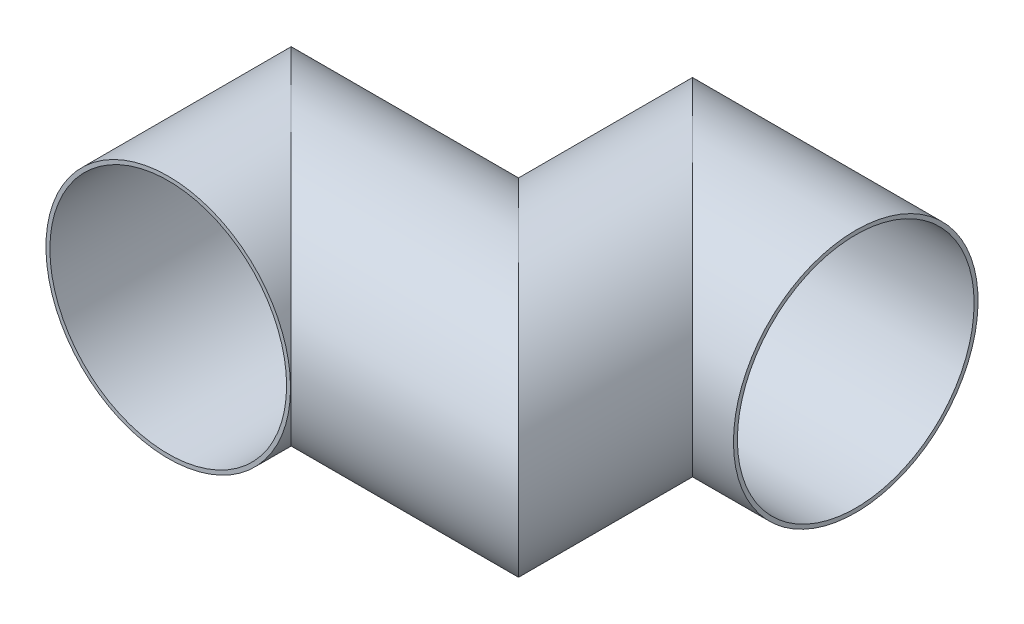
ISO-10303-21;
HEADER;
FILE_DESCRIPTION(('STEP AP214'),'2;1');
FILE_NAME('part.step','',(''),(''),'','','');
FILE_SCHEMA(('AUTOMOTIVE_DESIGN { 1 0 10303 214 1 1 1 1 }'));
ENDSEC;
DATA;
#1=APPLICATION_CONTEXT('core data for automotive mechanical design processes');
#2=APPLICATION_PROTOCOL_DEFINITION('international standard','automotive_design',2000,#1);
#3=PRODUCT_CONTEXT('',#1,'mechanical');
#4=PRODUCT('Part','Part','',(#3));
#5=PRODUCT_RELATED_PRODUCT_CATEGORY('part','',(#4));
#6=PRODUCT_DEFINITION_FORMATION('','',#4);
#7=PRODUCT_DEFINITION_CONTEXT('part definition',#1,'design');
#8=PRODUCT_DEFINITION('design','',#6,#7);
#9=PRODUCT_DEFINITION_SHAPE('','',#8);
#10=(LENGTH_UNIT() NAMED_UNIT(*) SI_UNIT(.MILLI.,.METRE.));
#11=(NAMED_UNIT(*) PLANE_ANGLE_UNIT() SI_UNIT($,.RADIAN.));
#12=(NAMED_UNIT(*) SI_UNIT($,.STERADIAN.) SOLID_ANGLE_UNIT());
#13=UNCERTAINTY_MEASURE_WITH_UNIT(LENGTH_MEASURE(1.E-05),#10,'distance_accuracy_value','');
#14=(GEOMETRIC_REPRESENTATION_CONTEXT(3) GLOBAL_UNCERTAINTY_ASSIGNED_CONTEXT((#13)) GLOBAL_UNIT_ASSIGNED_CONTEXT((#10,
#11,#12)) REPRESENTATION_CONTEXT('',''));
#15=CARTESIAN_POINT('',(0.,0.,0.));
#16=DIRECTION('',(0.,0.,1.));
#17=DIRECTION('',(1.,0.,0.));
#18=AXIS2_PLACEMENT_3D('',#15,#16,#17);
#19=CARTESIAN_POINT('',(99006.2987540279,0.,-75254.1938272896));
#20=DIRECTION('',(-1.,0.,0.));
#21=DIRECTION('',(0.,0.,1.));
#22=AXIS2_PLACEMENT_3D('',#19,#20,#21);
#23=PLANE('',#22);
#24=CARTESIAN_POINT('',(99006.2987540279,0.,-75254.1938272896));
#25=DIRECTION('',(-1.,0.,0.));
#26=DIRECTION('',(0.,0.,1.));
#27=AXIS2_PLACEMENT_3D('',#24,#25,#26);
#28=CIRCLE('',#27,30000.);
#29=CARTESIAN_POINT('',(99006.2987540279,0.,-45254.1938272896));
#30=VERTEX_POINT('',#29);
#31=EDGE_CURVE('E81',#30,#30,#28,.T.);
#32=ORIENTED_EDGE('',*,*,#31,.T.);
#33=EDGE_LOOP('',(#32));
#34=FACE_BOUND('',#33,.T.);
#35=CARTESIAN_POINT('',(99006.2987540279,0.,-75254.1938272896));
#36=DIRECTION('',(-1.,0.,0.));
#37=DIRECTION('',(0.,0.,1.));
#38=AXIS2_PLACEMENT_3D('',#35,#36,#37);
#39=CIRCLE('',#38,31000.);
#40=CARTESIAN_POINT('',(99006.2987540279,0.,-44254.1938272896));
#41=VERTEX_POINT('',#40);
#42=EDGE_CURVE('E73',#41,#41,#39,.T.);
#43=ORIENTED_EDGE('',*,*,#42,.F.);
#44=EDGE_LOOP('',(#43));
#45=FACE_BOUND('',#44,.T.);
#46=ADVANCED_FACE('F45',(#34,#45),#23,.F.);
#47=CARTESIAN_POINT('',(0.,0.,0.));
#48=DIRECTION('',(0.,0.,1.));
#49=DIRECTION('',(1.,0.,0.));
#50=AXIS2_PLACEMENT_3D('',#47,#48,#49);
#51=PLANE('',#50);
#52=CARTESIAN_POINT('',(0.,0.,0.));
#53=DIRECTION('',(0.,0.,1.));
#54=DIRECTION('',(1.,0.,0.));
#55=AXIS2_PLACEMENT_3D('',#52,#53,#54);
#56=CIRCLE('',#55,30000.);
#57=CARTESIAN_POINT('',(30000.,0.,0.));
#58=VERTEX_POINT('',#57);
#59=EDGE_CURVE('E93',#58,#58,#56,.T.);
#60=ORIENTED_EDGE('',*,*,#59,.F.);
#61=EDGE_LOOP('',(#60));
#62=FACE_BOUND('',#61,.T.);
#63=CARTESIAN_POINT('',(0.,0.,0.));
#64=DIRECTION('',(0.,0.,1.));
#65=DIRECTION('',(1.,0.,0.));
#66=AXIS2_PLACEMENT_3D('',#63,#64,#65);
#67=CIRCLE('',#66,31000.);
#68=CARTESIAN_POINT('',(31000.,0.,0.));
#69=VERTEX_POINT('',#68);
#70=EDGE_CURVE('E49',#69,#69,#67,.T.);
#71=ORIENTED_EDGE('',*,*,#70,.T.);
#72=EDGE_LOOP('',(#71));
#73=FACE_BOUND('',#72,.T.);
#74=ADVANCED_FACE('F104',(#62,#73),#51,.T.);
#75=CARTESIAN_POINT('',(24624.9,0.,-75254.1938272896));
#76=DIRECTION('',(1.,0.,0.));
#77=DIRECTION('',(0.,0.,-1.));
#78=AXIS2_PLACEMENT_3D('',#75,#76,#77);
#79=CYLINDRICAL_SURFACE('',#78,31000.);
#80=CARTESIAN_POINT('',(57625.,0.,-75254.1938272896));
#81=DIRECTION('',(0.707106781186547,0.,-0.707106781186547));
#82=DIRECTION('',(0.707106781186547,0.,0.707106781186547));
#83=AXIS2_PLACEMENT_3D('',#80,#81,#82);
#84=ELLIPSE('',#83,43840.6204335659,31000.);
#85=CARTESIAN_POINT('',(57625.,31000.,-75254.1938272896));
#86=VERTEX_POINT('',#85);
#87=EDGE_CURVE('E68',#86,#86,#84,.T.);
#88=ORIENTED_EDGE('',*,*,#87,.T.);
#89=EDGE_LOOP('',(#88));
#90=FACE_BOUND('',#89,.T.);
#91=ORIENTED_EDGE('',*,*,#42,.T.);
#92=EDGE_LOOP('',(#91));
#93=FACE_BOUND('',#92,.T.);
#94=ADVANCED_FACE('F69',(#90,#93),#79,.T.);
#95=CARTESIAN_POINT('',(57625.,0.,1834.71663330201));
#96=DIRECTION('',(0.,0.,-1.));
#97=DIRECTION('',(-1.,0.,0.));
#98=AXIS2_PLACEMENT_3D('',#95,#96,#97);
#99=CYLINDRICAL_SURFACE('',#98,31000.);
#100=CARTESIAN_POINT('',(57625.,0.,-31165.383366698));
#101=DIRECTION('',(0.707106781186547,0.,-0.707106781186547));
#102=DIRECTION('',(-0.707106781186547,0.,-0.707106781186547));
#103=AXIS2_PLACEMENT_3D('',#100,#101,#102);
#104=ELLIPSE('',#103,43840.6204335659,31000.);
#105=CARTESIAN_POINT('',(57625.,-31000.,-31165.383366698));
#106=VERTEX_POINT('',#105);
#107=EDGE_CURVE('E63',#106,#106,#104,.T.);
#108=ORIENTED_EDGE('',*,*,#107,.T.);
#109=EDGE_LOOP('',(#108));
#110=FACE_BOUND('',#109,.T.);
#111=ORIENTED_EDGE('',*,*,#87,.F.);
#112=EDGE_LOOP('',(#111));
#113=FACE_BOUND('',#112,.T.);
#114=ADVANCED_FACE('F123',(#110,#113),#99,.T.);
#115=CARTESIAN_POINT('',(-33000.1,0.,-31165.383366698));
#116=DIRECTION('',(1.,0.,0.));
#117=DIRECTION('',(0.,0.,-1.));
#118=AXIS2_PLACEMENT_3D('',#115,#116,#117);
#119=CYLINDRICAL_SURFACE('',#118,31000.);
#120=CARTESIAN_POINT('',(0.,0.,-31165.383366698));
#121=DIRECTION('',(0.707106781186547,0.,-0.707106781186547));
#122=DIRECTION('',(0.707106781186547,0.,0.707106781186547));
#123=AXIS2_PLACEMENT_3D('',#120,#121,#122);
#124=ELLIPSE('',#123,43840.6204335659,31000.);
#125=CARTESIAN_POINT('',(0.,31000.,-31165.383366698));
#126=VERTEX_POINT('',#125);
#127=EDGE_CURVE('E11',#126,#126,#124,.T.);
#128=ORIENTED_EDGE('',*,*,#127,.T.);
#129=EDGE_LOOP('',(#128));
#130=FACE_BOUND('',#129,.T.);
#131=ORIENTED_EDGE('',*,*,#107,.F.);
#132=EDGE_LOOP('',(#131));
#133=FACE_BOUND('',#132,.T.);
#134=ADVANCED_FACE('F115',(#130,#133),#119,.T.);
#135=CARTESIAN_POINT('',(0.,0.,0.));
#136=DIRECTION('',(0.,0.,-1.));
#137=DIRECTION('',(-1.,0.,0.));
#138=AXIS2_PLACEMENT_3D('',#135,#136,#137);
#139=CYLINDRICAL_SURFACE('',#138,31000.);
#140=ORIENTED_EDGE('',*,*,#70,.F.);
#141=EDGE_LOOP('',(#140));
#142=FACE_BOUND('',#141,.T.);
#143=ORIENTED_EDGE('',*,*,#127,.F.);
#144=EDGE_LOOP('',(#143));
#145=FACE_BOUND('',#144,.T.);
#146=ADVANCED_FACE('F47',(#142,#145),#139,.T.);
#147=CARTESIAN_POINT('',(24624.9,0.,-75254.1938272896));
#148=DIRECTION('',(1.,0.,0.));
#149=DIRECTION('',(0.,0.,-1.));
#150=AXIS2_PLACEMENT_3D('',#147,#148,#149);
#151=CYLINDRICAL_SURFACE('',#150,30000.);
#152=CARTESIAN_POINT('',(57625.,0.,-75254.1938272896));
#153=DIRECTION('',(0.707106781186548,0.,-0.707106781186548));
#154=DIRECTION('',(-0.707106781186548,0.,-0.707106781186548));
#155=AXIS2_PLACEMENT_3D('',#152,#153,#154);
#156=ELLIPSE('',#155,42426.4068711928,30000.);
#157=CARTESIAN_POINT('',(27625.,0.,-105254.19382729));
#158=VERTEX_POINT('',#157);
#159=EDGE_CURVE('E85',#158,#158,#156,.T.);
#160=ORIENTED_EDGE('',*,*,#159,.F.);
#161=EDGE_LOOP('',(#160));
#162=FACE_BOUND('',#161,.T.);
#163=ORIENTED_EDGE('',*,*,#31,.F.);
#164=EDGE_LOOP('',(#163));
#165=FACE_BOUND('',#164,.T.);
#166=ADVANCED_FACE('F114',(#162,#165),#151,.F.);
#167=CARTESIAN_POINT('',(57625.,0.,1834.71663330201));
#168=DIRECTION('',(0.,0.,-1.));
#169=DIRECTION('',(-1.,0.,0.));
#170=AXIS2_PLACEMENT_3D('',#167,#168,#169);
#171=CYLINDRICAL_SURFACE('',#170,30000.);
#172=CARTESIAN_POINT('',(57625.,0.,-31165.383366698));
#173=DIRECTION('',(0.707106781186548,0.,-0.707106781186548));
#174=DIRECTION('',(0.707106781186548,0.,0.707106781186548));
#175=AXIS2_PLACEMENT_3D('',#172,#173,#174);
#176=ELLIPSE('',#175,42426.4068711928,30000.);
#177=CARTESIAN_POINT('',(87625.,0.,-1165.38336669799));
#178=VERTEX_POINT('',#177);
#179=EDGE_CURVE('E89',#178,#178,#176,.T.);
#180=ORIENTED_EDGE('',*,*,#179,.F.);
#181=EDGE_LOOP('',(#180));
#182=FACE_BOUND('',#181,.T.);
#183=ORIENTED_EDGE('',*,*,#159,.T.);
#184=EDGE_LOOP('',(#183));
#185=FACE_BOUND('',#184,.T.);
#186=ADVANCED_FACE('F120',(#182,#185),#171,.F.);
#187=CARTESIAN_POINT('',(-33000.1,0.,-31165.383366698));
#188=DIRECTION('',(1.,0.,0.));
#189=DIRECTION('',(0.,0.,-1.));
#190=AXIS2_PLACEMENT_3D('',#187,#188,#189);
#191=CYLINDRICAL_SURFACE('',#190,30000.);
#192=CARTESIAN_POINT('',(0.,0.,-31165.383366698));
#193=DIRECTION('',(0.707106781186548,0.,-0.707106781186548));
#194=DIRECTION('',(-0.707106781186548,0.,-0.707106781186548));
#195=AXIS2_PLACEMENT_3D('',#192,#193,#194);
#196=ELLIPSE('',#195,42426.4068711928,30000.);
#197=CARTESIAN_POINT('',(-30000.,0.,-61165.383366698));
#198=VERTEX_POINT('',#197);
#199=EDGE_CURVE('E79',#198,#198,#196,.T.);
#200=ORIENTED_EDGE('',*,*,#199,.F.);
#201=EDGE_LOOP('',(#200));
#202=FACE_BOUND('',#201,.T.);
#203=ORIENTED_EDGE('',*,*,#179,.T.);
#204=EDGE_LOOP('',(#203));
#205=FACE_BOUND('',#204,.T.);
#206=ADVANCED_FACE('F137',(#202,#205),#191,.F.);
#207=CARTESIAN_POINT('',(0.,0.,0.));
#208=DIRECTION('',(0.,0.,-1.));
#209=DIRECTION('',(-1.,0.,0.));
#210=AXIS2_PLACEMENT_3D('',#207,#208,#209);
#211=CYLINDRICAL_SURFACE('',#210,30000.);
#212=ORIENTED_EDGE('',*,*,#59,.T.);
#213=EDGE_LOOP('',(#212));
#214=FACE_BOUND('',#213,.T.);
#215=ORIENTED_EDGE('',*,*,#199,.T.);
#216=EDGE_LOOP('',(#215));
#217=FACE_BOUND('',#216,.T.);
#218=ADVANCED_FACE('F101',(#214,#217),#211,.F.);
#219=CLOSED_SHELL('',(#46,#74,#94,#114,#134,#146,#166,#186,#206,#218));
#220=MANIFOLD_SOLID_BREP('B2',#219);
#221=ADVANCED_BREP_SHAPE_REPRESENTATION('',(#18,#220),#14);
#222=SHAPE_DEFINITION_REPRESENTATION(#9,#221);
ENDSEC;
END-ISO-10303-21;
